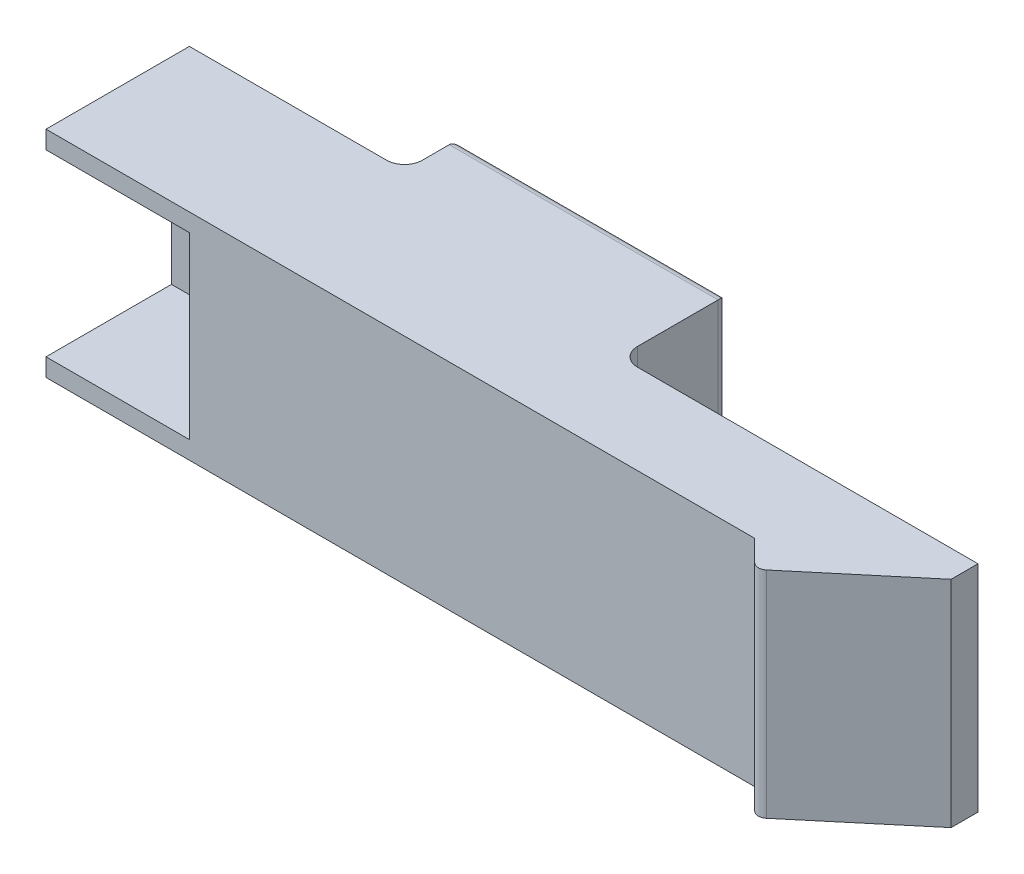
ISO-10303-21;
HEADER;
FILE_DESCRIPTION(('STEP AP214'),'2;1');
FILE_NAME('part.step','',(''),(''),'','','');
FILE_SCHEMA(('AUTOMOTIVE_DESIGN { 1 0 10303 214 1 1 1 1 }'));
ENDSEC;
DATA;
#1=APPLICATION_CONTEXT('core data for automotive mechanical design processes');
#2=APPLICATION_PROTOCOL_DEFINITION('international standard','automotive_design',2000,#1);
#3=PRODUCT_CONTEXT('',#1,'mechanical');
#4=PRODUCT('Part','Part','',(#3));
#5=PRODUCT_RELATED_PRODUCT_CATEGORY('part','',(#4));
#6=PRODUCT_DEFINITION_FORMATION('','',#4);
#7=PRODUCT_DEFINITION_CONTEXT('part definition',#1,'design');
#8=PRODUCT_DEFINITION('design','',#6,#7);
#9=PRODUCT_DEFINITION_SHAPE('','',#8);
#10=(LENGTH_UNIT() NAMED_UNIT(*) SI_UNIT(.MILLI.,.METRE.));
#11=(NAMED_UNIT(*) PLANE_ANGLE_UNIT() SI_UNIT($,.RADIAN.));
#12=(NAMED_UNIT(*) SI_UNIT($,.STERADIAN.) SOLID_ANGLE_UNIT());
#13=UNCERTAINTY_MEASURE_WITH_UNIT(LENGTH_MEASURE(1.E-05),#10,'distance_accuracy_value','');
#14=(GEOMETRIC_REPRESENTATION_CONTEXT(3) GLOBAL_UNCERTAINTY_ASSIGNED_CONTEXT((#13)) GLOBAL_UNIT_ASSIGNED_CONTEXT((#10,
#11,#12)) REPRESENTATION_CONTEXT('',''));
#15=CARTESIAN_POINT('',(0.,0.,0.));
#16=DIRECTION('',(0.,0.,1.));
#17=DIRECTION('',(1.,0.,0.));
#18=AXIS2_PLACEMENT_3D('',#15,#16,#17);
#19=CARTESIAN_POINT('',(0.,0.,0.));
#20=DIRECTION('',(0.,0.,-1.));
#21=DIRECTION('',(-1.,0.,0.));
#22=AXIS2_PLACEMENT_3D('',#19,#20,#21);
#23=PLANE('',#22);
#24=DIRECTION('',(-1.,0.,0.));
#25=VECTOR('',#24,1.);
#26=CARTESIAN_POINT('',(0.,4.5,0.));
#27=LINE('',#26,#25);
#28=CARTESIAN_POINT('',(6.00000000000001,4.5,0.));
#29=VERTEX_POINT('',#28);
#30=CARTESIAN_POINT('',(-5.99999999999999,4.5,0.));
#31=VERTEX_POINT('',#30);
#32=EDGE_CURVE('E333',#29,#31,#27,.T.);
#33=ORIENTED_EDGE('',*,*,#32,.T.);
#34=DIRECTION('',(0.,-1.,0.));
#35=VECTOR('',#34,1.);
#36=CARTESIAN_POINT('',(-5.99999999999999,0.,0.));
#37=LINE('',#36,#35);
#38=CARTESIAN_POINT('',(-5.99999999999999,-4.5,0.));
#39=VERTEX_POINT('',#38);
#40=EDGE_CURVE('E339',#31,#39,#37,.T.);
#41=ORIENTED_EDGE('',*,*,#40,.T.);
#42=DIRECTION('',(1.,0.,0.));
#43=VECTOR('',#42,1.);
#44=CARTESIAN_POINT('',(0.,-4.5,0.));
#45=LINE('',#44,#43);
#46=CARTESIAN_POINT('',(6.00000000000001,-4.5,0.));
#47=VERTEX_POINT('',#46);
#48=EDGE_CURVE('E337',#39,#47,#45,.T.);
#49=ORIENTED_EDGE('',*,*,#48,.T.);
#50=DIRECTION('',(0.,1.,0.));
#51=VECTOR('',#50,1.);
#52=CARTESIAN_POINT('',(6.00000000000001,0.,0.));
#53=LINE('',#52,#51);
#54=EDGE_CURVE('E335',#47,#29,#53,.T.);
#55=ORIENTED_EDGE('',*,*,#54,.T.);
#56=EDGE_LOOP('',(#33,#41,#49,#55));
#57=FACE_BOUND('',#56,.T.);
#58=DIRECTION('',(1.,0.,0.));
#59=VECTOR('',#58,1.);
#60=CARTESIAN_POINT('',(-7.49999999999999,-5.5,0.));
#61=LINE('',#60,#59);
#62=CARTESIAN_POINT('',(7.,-5.5,0.));
#63=VERTEX_POINT('',#62);
#64=CARTESIAN_POINT('',(-6.99999999999999,-5.5,0.));
#65=VERTEX_POINT('',#64);
#66=EDGE_CURVE('E328',#63,#65,#61,.F.);
#67=ORIENTED_EDGE('',*,*,#66,.T.);
#68=DIRECTION('',(0.,-1.,0.));
#69=VECTOR('',#68,1.);
#70=CARTESIAN_POINT('',(-6.99999999999999,6.,0.));
#71=LINE('',#70,#69);
#72=CARTESIAN_POINT('',(-6.99999999999999,5.5,0.));
#73=VERTEX_POINT('',#72);
#74=EDGE_CURVE('E330',#65,#73,#71,.F.);
#75=ORIENTED_EDGE('',*,*,#74,.T.);
#76=DIRECTION('',(-1.,0.,0.));
#77=VECTOR('',#76,1.);
#78=CARTESIAN_POINT('',(7.50000000000001,5.5,0.));
#79=LINE('',#78,#77);
#80=CARTESIAN_POINT('',(7.,5.5,0.));
#81=VERTEX_POINT('',#80);
#82=EDGE_CURVE('E324',#73,#81,#79,.F.);
#83=ORIENTED_EDGE('',*,*,#82,.T.);
#84=DIRECTION('',(0.,1.,0.));
#85=VECTOR('',#84,1.);
#86=CARTESIAN_POINT('',(7.,-6.,0.));
#87=LINE('',#86,#85);
#88=EDGE_CURVE('E326',#81,#63,#87,.F.);
#89=ORIENTED_EDGE('',*,*,#88,.T.);
#90=EDGE_LOOP('',(#67,#75,#83,#89));
#91=FACE_BOUND('',#90,.T.);
#92=ADVANCED_FACE('F35',(#57,#91),#23,.T.);
#93=CARTESIAN_POINT('',(7.50000000000001,-6.,11.));
#94=DIRECTION('',(-1.,0.,0.));
#95=DIRECTION('',(0.,0.,1.));
#96=AXIS2_PLACEMENT_3D('',#93,#94,#95);
#97=PLANE('',#96);
#98=DIRECTION('',(0.,0.,-1.));
#99=VECTOR('',#98,1.);
#100=CARTESIAN_POINT('',(7.50000000000001,6.,11.));
#101=LINE('',#100,#99);
#102=CARTESIAN_POINT('',(7.50000000000001,6.,5.));
#103=VERTEX_POINT('',#102);
#104=CARTESIAN_POINT('',(7.50000000000001,6.,0.5));
#105=VERTEX_POINT('',#104);
#106=EDGE_CURVE('E322',#103,#105,#101,.T.);
#107=ORIENTED_EDGE('',*,*,#106,.F.);
#108=DIRECTION('',(0.,-1.,0.));
#109=VECTOR('',#108,1.);
#110=CARTESIAN_POINT('',(7.50000000000001,-6.,5.));
#111=LINE('',#110,#109);
#112=CARTESIAN_POINT('',(7.50000000000001,-6.,5.));
#113=VERTEX_POINT('',#112);
#114=EDGE_CURVE('E363',#103,#113,#111,.T.);
#115=ORIENTED_EDGE('',*,*,#114,.T.);
#116=DIRECTION('',(0.,0.,-1.));
#117=VECTOR('',#116,1.);
#118=CARTESIAN_POINT('',(7.50000000000001,-6.,11.));
#119=LINE('',#118,#117);
#120=CARTESIAN_POINT('',(7.50000000000001,-6.,0.5));
#121=VERTEX_POINT('',#120);
#122=EDGE_CURVE('E316',#113,#121,#119,.T.);
#123=ORIENTED_EDGE('',*,*,#122,.T.);
#124=DIRECTION('',(0.,1.,0.));
#125=VECTOR('',#124,1.);
#126=CARTESIAN_POINT('',(7.50000000000001,6.,0.5));
#127=LINE('',#126,#125);
#128=EDGE_CURVE('E355',#121,#105,#127,.T.);
#129=ORIENTED_EDGE('',*,*,#128,.T.);
#130=EDGE_LOOP('',(#107,#115,#123,#129));
#131=FACE_BOUND('',#130,.T.);
#132=ADVANCED_FACE('F445',(#131),#97,.F.);
#133=CARTESIAN_POINT('',(-7.49999999999999,6.,11.));
#134=DIRECTION('',(0.,-1.,0.));
#135=DIRECTION('',(0.,0.,-1.));
#136=AXIS2_PLACEMENT_3D('',#133,#134,#135);
#137=PLANE('',#136);
#138=DIRECTION('',(0.707106781186546,0.,0.707106781186549));
#139=VECTOR('',#138,1.);
#140=CARTESIAN_POINT('',(20.041232037029,6.,11.));
#141=LINE('',#140,#139);
#142=CARTESIAN_POINT('',(20.041232037029,6.,11.));
#143=VERTEX_POINT('',#142);
#144=CARTESIAN_POINT('',(21.2172600435488,6.,12.1760280065198));
#145=VERTEX_POINT('',#144);
#146=EDGE_CURVE('E202',#143,#145,#141,.T.);
#147=ORIENTED_EDGE('',*,*,#146,.T.);
#148=CARTESIAN_POINT('',(21.5708134341421,6.,11.8224746159265));
#149=DIRECTION('',(0.,-1.,0.));
#150=DIRECTION('',(0.,0.,-1.));
#151=AXIS2_PLACEMENT_3D('',#148,#149,#150);
#152=CIRCLE('',#151,0.5);
#153=CARTESIAN_POINT('',(21.8922072389853,6.,12.205496837486));
#154=VERTEX_POINT('',#153);
#155=EDGE_CURVE('E57',#145,#154,#152,.F.);
#156=ORIENTED_EDGE('',*,*,#155,.T.);
#157=DIRECTION('',(0.766044443118977,0.,-0.64278760968654));
#158=VECTOR('',#157,1.);
#159=CARTESIAN_POINT('',(21.541232037029,6.,12.5));
#160=LINE('',#159,#158);
#161=CARTESIAN_POINT('',(27.5,6.,7.5));
#162=VERTEX_POINT('',#161);
#163=EDGE_CURVE('E226',#154,#162,#160,.T.);
#164=ORIENTED_EDGE('',*,*,#163,.T.);
#165=DIRECTION('',(0.,0.,-1.));
#166=VECTOR('',#165,1.);
#167=CARTESIAN_POINT('',(27.5,6.,7.5));
#168=LINE('',#167,#166);
#169=CARTESIAN_POINT('',(27.5,6.,6.));
#170=VERTEX_POINT('',#169);
#171=EDGE_CURVE('E228',#162,#170,#168,.T.);
#172=ORIENTED_EDGE('',*,*,#171,.T.);
#173=DIRECTION('',(1.,0.,0.));
#174=VECTOR('',#173,1.);
#175=CARTESIAN_POINT('',(7.50000000000001,6.,6.));
#176=LINE('',#175,#174);
#177=CARTESIAN_POINT('',(8.5,6.,6.));
#178=VERTEX_POINT('',#177);
#179=EDGE_CURVE('E247',#178,#170,#176,.T.);
#180=ORIENTED_EDGE('',*,*,#179,.F.);
#181=CARTESIAN_POINT('',(8.5,6.,5.));
#182=DIRECTION('',(0.,-1.,0.));
#183=DIRECTION('',(0.,0.,-1.));
#184=AXIS2_PLACEMENT_3D('',#181,#182,#183);
#185=CIRCLE('',#184,1.);
#186=EDGE_CURVE('E389',#178,#103,#185,.T.);
#187=ORIENTED_EDGE('',*,*,#186,.T.);
#188=ORIENTED_EDGE('',*,*,#106,.T.);
#189=DIRECTION('',(-1.,0.,0.));
#190=VECTOR('',#189,1.);
#191=CARTESIAN_POINT('',(-7.49999999999999,6.,0.5));
#192=LINE('',#191,#190);
#193=CARTESIAN_POINT('',(-7.49999999999999,6.,0.5));
#194=VERTEX_POINT('',#193);
#195=EDGE_CURVE('E360',#105,#194,#192,.T.);
#196=ORIENTED_EDGE('',*,*,#195,.T.);
#197=DIRECTION('',(0.,0.,-1.));
#198=VECTOR('',#197,1.);
#199=CARTESIAN_POINT('',(-7.49999999999999,6.,11.));
#200=LINE('',#199,#198);
#201=CARTESIAN_POINT('',(-7.49999999999999,6.,2.));
#202=VERTEX_POINT('',#201);
#203=EDGE_CURVE('E320',#202,#194,#200,.T.);
#204=ORIENTED_EDGE('',*,*,#203,.F.);
#205=CARTESIAN_POINT('',(-8.49999999999999,6.,2.));
#206=DIRECTION('',(0.,-1.,0.));
#207=DIRECTION('',(0.,0.,-1.));
#208=AXIS2_PLACEMENT_3D('',#205,#206,#207);
#209=CIRCLE('',#208,1.);
#210=CARTESIAN_POINT('',(-8.49999999999999,6.,3.));
#211=VERTEX_POINT('',#210);
#212=EDGE_CURVE('E396',#202,#211,#209,.T.);
#213=ORIENTED_EDGE('',*,*,#212,.T.);
#214=DIRECTION('',(-1.,0.,0.));
#215=VECTOR('',#214,1.);
#216=CARTESIAN_POINT('',(-19.5,6.,3.));
#217=LINE('',#216,#215);
#218=CARTESIAN_POINT('',(-19.5,6.,3.));
#219=VERTEX_POINT('',#218);
#220=EDGE_CURVE('E281',#211,#219,#217,.T.);
#221=ORIENTED_EDGE('',*,*,#220,.T.);
#222=DIRECTION('',(0.,0.,1.));
#223=VECTOR('',#222,1.);
#224=CARTESIAN_POINT('',(-19.5,6.,3.));
#225=LINE('',#224,#223);
#226=CARTESIAN_POINT('',(-19.5,6.,11.));
#227=VERTEX_POINT('',#226);
#228=EDGE_CURVE('E204',#219,#227,#225,.T.);
#229=ORIENTED_EDGE('',*,*,#228,.T.);
#230=DIRECTION('',(-1.,0.,0.));
#231=VECTOR('',#230,1.);
#232=CARTESIAN_POINT('',(-7.49999999999999,6.,11.));
#233=LINE('',#232,#231);
#234=EDGE_CURVE('E198',#143,#227,#233,.T.);
#235=ORIENTED_EDGE('',*,*,#234,.F.);
#236=EDGE_LOOP('',(#147,#156,#164,#172,#180,#187,#188,#196,#204,#213,#221,#229,#235));
#237=FACE_BOUND('',#236,.T.);
#238=ADVANCED_FACE('F200',(#237),#137,.F.);
#239=CARTESIAN_POINT('',(-7.49999999999999,-6.,11.));
#240=DIRECTION('',(1.,0.,0.));
#241=DIRECTION('',(0.,0.,-1.));
#242=AXIS2_PLACEMENT_3D('',#239,#240,#241);
#243=PLANE('',#242);
#244=DIRECTION('',(0.,0.,-1.));
#245=VECTOR('',#244,1.);
#246=CARTESIAN_POINT('',(-7.49999999999999,-6.,11.));
#247=LINE('',#246,#245);
#248=CARTESIAN_POINT('',(-7.49999999999999,-6.,2.));
#249=VERTEX_POINT('',#248);
#250=CARTESIAN_POINT('',(-7.49999999999999,-6.,0.5));
#251=VERTEX_POINT('',#250);
#252=EDGE_CURVE('E318',#249,#251,#247,.T.);
#253=ORIENTED_EDGE('',*,*,#252,.F.);
#254=DIRECTION('',(0.,1.,0.));
#255=VECTOR('',#254,1.);
#256=CARTESIAN_POINT('',(-7.49999999999999,-6.,2.));
#257=LINE('',#256,#255);
#258=EDGE_CURVE('E391',#249,#202,#257,.T.);
#259=ORIENTED_EDGE('',*,*,#258,.T.);
#260=ORIENTED_EDGE('',*,*,#203,.T.);
#261=DIRECTION('',(0.,-1.,0.));
#262=VECTOR('',#261,1.);
#263=CARTESIAN_POINT('',(-7.49999999999999,-6.,0.5));
#264=LINE('',#263,#262);
#265=EDGE_CURVE('E345',#194,#251,#264,.T.);
#266=ORIENTED_EDGE('',*,*,#265,.T.);
#267=EDGE_LOOP('',(#253,#259,#260,#266));
#268=FACE_BOUND('',#267,.T.);
#269=ADVANCED_FACE('F410',(#268),#243,.F.);
#270=CARTESIAN_POINT('',(-7.49999999999999,-6.,11.));
#271=DIRECTION('',(0.,1.,0.));
#272=DIRECTION('',(0.,0.,1.));
#273=AXIS2_PLACEMENT_3D('',#270,#271,#272);
#274=PLANE('',#273);
#275=DIRECTION('',(0.766044443118977,0.,-0.64278760968654));
#276=VECTOR('',#275,1.);
#277=CARTESIAN_POINT('',(21.541232037029,-6.,12.5));
#278=LINE('',#277,#276);
#279=CARTESIAN_POINT('',(21.8922072389853,-6.,12.205496837486));
#280=VERTEX_POINT('',#279);
#281=CARTESIAN_POINT('',(27.5,-6.,7.5));
#282=VERTEX_POINT('',#281);
#283=EDGE_CURVE('E235',#280,#282,#278,.T.);
#284=ORIENTED_EDGE('',*,*,#283,.F.);
#285=CARTESIAN_POINT('',(21.5708134341421,-6.,11.8224746159265));
#286=DIRECTION('',(0.,1.,0.));
#287=DIRECTION('',(0.,0.,1.));
#288=AXIS2_PLACEMENT_3D('',#285,#286,#287);
#289=CIRCLE('',#288,0.5);
#290=CARTESIAN_POINT('',(21.2172600435488,-6.,12.1760280065198));
#291=VERTEX_POINT('',#290);
#292=EDGE_CURVE('E11',#280,#291,#289,.F.);
#293=ORIENTED_EDGE('',*,*,#292,.T.);
#294=DIRECTION('',(0.707106781186546,0.,0.707106781186549));
#295=VECTOR('',#294,1.);
#296=CARTESIAN_POINT('',(20.041232037029,-6.,11.));
#297=LINE('',#296,#295);
#298=CARTESIAN_POINT('',(20.041232037029,-6.,11.));
#299=VERTEX_POINT('',#298);
#300=EDGE_CURVE('E233',#299,#291,#297,.T.);
#301=ORIENTED_EDGE('',*,*,#300,.F.);
#302=DIRECTION('',(1.,0.,0.));
#303=VECTOR('',#302,1.);
#304=CARTESIAN_POINT('',(-7.49999999999999,-6.,11.));
#305=LINE('',#304,#303);
#306=CARTESIAN_POINT('',(-19.5,-6.,11.));
#307=VERTEX_POINT('',#306);
#308=EDGE_CURVE('E208',#307,#299,#305,.T.);
#309=ORIENTED_EDGE('',*,*,#308,.F.);
#310=DIRECTION('',(0.,0.,1.));
#311=VECTOR('',#310,1.);
#312=CARTESIAN_POINT('',(-19.5,-6.,3.));
#313=LINE('',#312,#311);
#314=CARTESIAN_POINT('',(-19.5,-6.,3.));
#315=VERTEX_POINT('',#314);
#316=EDGE_CURVE('E291',#315,#307,#313,.T.);
#317=ORIENTED_EDGE('',*,*,#316,.F.);
#318=DIRECTION('',(1.,0.,0.));
#319=VECTOR('',#318,1.);
#320=CARTESIAN_POINT('',(-7.49999999999999,-6.,3.));
#321=LINE('',#320,#319);
#322=CARTESIAN_POINT('',(-8.49999999999999,-6.,3.));
#323=VERTEX_POINT('',#322);
#324=EDGE_CURVE('E287',#315,#323,#321,.T.);
#325=ORIENTED_EDGE('',*,*,#324,.T.);
#326=CARTESIAN_POINT('',(-8.49999999999999,-6.,2.));
#327=DIRECTION('',(0.,1.,0.));
#328=DIRECTION('',(0.,0.,1.));
#329=AXIS2_PLACEMENT_3D('',#326,#327,#328);
#330=CIRCLE('',#329,1.);
#331=EDGE_CURVE('E398',#323,#249,#330,.T.);
#332=ORIENTED_EDGE('',*,*,#331,.T.);
#333=ORIENTED_EDGE('',*,*,#252,.T.);
#334=DIRECTION('',(1.,0.,0.));
#335=VECTOR('',#334,1.);
#336=CARTESIAN_POINT('',(7.50000000000001,-6.,0.5));
#337=LINE('',#336,#335);
#338=EDGE_CURVE('E348',#251,#121,#337,.T.);
#339=ORIENTED_EDGE('',*,*,#338,.T.);
#340=ORIENTED_EDGE('',*,*,#122,.F.);
#341=CARTESIAN_POINT('',(8.5,-6.,5.));
#342=DIRECTION('',(0.,1.,0.));
#343=DIRECTION('',(0.,0.,1.));
#344=AXIS2_PLACEMENT_3D('',#341,#342,#343);
#345=CIRCLE('',#344,1.);
#346=CARTESIAN_POINT('',(8.5,-6.,6.));
#347=VERTEX_POINT('',#346);
#348=EDGE_CURVE('E387',#113,#347,#345,.T.);
#349=ORIENTED_EDGE('',*,*,#348,.T.);
#350=DIRECTION('',(-1.,0.,0.));
#351=VECTOR('',#350,1.);
#352=CARTESIAN_POINT('',(12.5,-6.,6.));
#353=LINE('',#352,#351);
#354=CARTESIAN_POINT('',(27.5,-6.,6.));
#355=VERTEX_POINT('',#354);
#356=EDGE_CURVE('E242',#355,#347,#353,.T.);
#357=ORIENTED_EDGE('',*,*,#356,.F.);
#358=DIRECTION('',(0.,0.,-1.));
#359=VECTOR('',#358,1.);
#360=CARTESIAN_POINT('',(27.5,-6.,7.5));
#361=LINE('',#360,#359);
#362=EDGE_CURVE('E220',#282,#355,#361,.T.);
#363=ORIENTED_EDGE('',*,*,#362,.F.);
#364=EDGE_LOOP('',(#284,#293,#301,#309,#317,#325,#332,#333,#339,#340,#349,#357,#363));
#365=FACE_BOUND('',#364,.T.);
#366=ADVANCED_FACE('F404',(#365),#274,.F.);
#367=CARTESIAN_POINT('',(0.,0.,11.));
#368=DIRECTION('',(0.,0.,-1.));
#369=DIRECTION('',(-1.,0.,0.));
#370=AXIS2_PLACEMENT_3D('',#367,#368,#369);
#371=PLANE('',#370);
#372=DIRECTION('',(0.,1.,0.));
#373=VECTOR('',#372,1.);
#374=CARTESIAN_POINT('',(-11.5,5.,11.));
#375=LINE('',#374,#373);
#376=CARTESIAN_POINT('',(-11.5,-5.,11.));
#377=VERTEX_POINT('',#376);
#378=CARTESIAN_POINT('',(-11.5,5.,11.));
#379=VERTEX_POINT('',#378);
#380=EDGE_CURVE('E253',#377,#379,#375,.T.);
#381=ORIENTED_EDGE('',*,*,#380,.F.);
#382=DIRECTION('',(-1.,0.,0.));
#383=VECTOR('',#382,1.);
#384=CARTESIAN_POINT('',(-11.5,-5.,11.));
#385=LINE('',#384,#383);
#386=CARTESIAN_POINT('',(-19.5,-5.,11.));
#387=VERTEX_POINT('',#386);
#388=EDGE_CURVE('E263',#377,#387,#385,.T.);
#389=ORIENTED_EDGE('',*,*,#388,.T.);
#390=DIRECTION('',(0.,-1.,0.));
#391=VECTOR('',#390,1.);
#392=CARTESIAN_POINT('',(-19.5,-6.,11.));
#393=LINE('',#392,#391);
#394=EDGE_CURVE('E274',#387,#307,#393,.T.);
#395=ORIENTED_EDGE('',*,*,#394,.T.);
#396=ORIENTED_EDGE('',*,*,#308,.T.);
#397=DIRECTION('',(0.,1.,0.));
#398=VECTOR('',#397,1.);
#399=CARTESIAN_POINT('',(20.041232037029,-6.,11.));
#400=LINE('',#399,#398);
#401=EDGE_CURVE('E212',#299,#143,#400,.T.);
#402=ORIENTED_EDGE('',*,*,#401,.T.);
#403=ORIENTED_EDGE('',*,*,#234,.T.);
#404=CARTESIAN_POINT('',(-19.5,5.,11.));
#405=VERTEX_POINT('',#404);
#406=EDGE_CURVE('E284',#227,#405,#393,.T.);
#407=ORIENTED_EDGE('',*,*,#406,.T.);
#408=DIRECTION('',(-1.,0.,0.));
#409=VECTOR('',#408,1.);
#410=CARTESIAN_POINT('',(-11.5,5.,11.));
#411=LINE('',#410,#409);
#412=EDGE_CURVE('E277',#379,#405,#411,.T.);
#413=ORIENTED_EDGE('',*,*,#412,.F.);
#414=EDGE_LOOP('',(#381,#389,#395,#396,#402,#403,#407,#413));
#415=FACE_BOUND('',#414,.T.);
#416=ADVANCED_FACE('F214',(#415),#371,.F.);
#417=CARTESIAN_POINT('',(5.50000000000001,-6.,11.));
#418=DIRECTION('',(-1.,0.,0.));
#419=DIRECTION('',(0.,0.,1.));
#420=AXIS2_PLACEMENT_3D('',#417,#418,#419);
#421=PLANE('',#420);
#422=DIRECTION('',(0.,0.,-1.));
#423=VECTOR('',#422,1.);
#424=CARTESIAN_POINT('',(5.50000000000001,4.,11.));
#425=LINE('',#424,#423);
#426=CARTESIAN_POINT('',(5.50000000000001,4.,9.));
#427=VERTEX_POINT('',#426);
#428=CARTESIAN_POINT('',(5.50000000000001,4.,0.5));
#429=VERTEX_POINT('',#428);
#430=EDGE_CURVE('E209',#427,#429,#425,.T.);
#431=ORIENTED_EDGE('',*,*,#430,.T.);
#432=DIRECTION('',(0.,1.,0.));
#433=VECTOR('',#432,1.);
#434=CARTESIAN_POINT('',(5.50000000000001,-6.,0.5));
#435=LINE('',#434,#433);
#436=CARTESIAN_POINT('',(5.50000000000001,-4.,0.5));
#437=VERTEX_POINT('',#436);
#438=EDGE_CURVE('E353',#429,#437,#435,.F.);
#439=ORIENTED_EDGE('',*,*,#438,.T.);
#440=DIRECTION('',(0.,0.,-1.));
#441=VECTOR('',#440,1.);
#442=CARTESIAN_POINT('',(5.50000000000001,-4.,11.));
#443=LINE('',#442,#441);
#444=CARTESIAN_POINT('',(5.50000000000001,-4.,9.));
#445=VERTEX_POINT('',#444);
#446=EDGE_CURVE('E302',#445,#437,#443,.T.);
#447=ORIENTED_EDGE('',*,*,#446,.F.);
#448=DIRECTION('',(0.,1.,0.));
#449=VECTOR('',#448,1.);
#450=CARTESIAN_POINT('',(5.50000000000001,0.,9.));
#451=LINE('',#450,#449);
#452=EDGE_CURVE('E294',#445,#427,#451,.T.);
#453=ORIENTED_EDGE('',*,*,#452,.T.);
#454=EDGE_LOOP('',(#431,#439,#447,#453));
#455=FACE_BOUND('',#454,.T.);
#456=ADVANCED_FACE('F588',(#455),#421,.T.);
#457=CARTESIAN_POINT('',(-7.49999999999999,4.,11.));
#458=DIRECTION('',(0.,-1.,0.));
#459=DIRECTION('',(0.,0.,-1.));
#460=AXIS2_PLACEMENT_3D('',#457,#458,#459);
#461=PLANE('',#460);
#462=DIRECTION('',(0.,0.,-1.));
#463=VECTOR('',#462,1.);
#464=CARTESIAN_POINT('',(-5.49999999999999,4.,11.));
#465=LINE('',#464,#463);
#466=CARTESIAN_POINT('',(-5.49999999999999,4.,9.));
#467=VERTEX_POINT('',#466);
#468=CARTESIAN_POINT('',(-5.49999999999999,4.,0.5));
#469=VERTEX_POINT('',#468);
#470=EDGE_CURVE('E298',#467,#469,#465,.T.);
#471=ORIENTED_EDGE('',*,*,#470,.T.);
#472=DIRECTION('',(-1.,0.,0.));
#473=VECTOR('',#472,1.);
#474=CARTESIAN_POINT('',(-7.49999999999999,4.,0.5));
#475=LINE('',#474,#473);
#476=EDGE_CURVE('E358',#469,#429,#475,.F.);
#477=ORIENTED_EDGE('',*,*,#476,.T.);
#478=ORIENTED_EDGE('',*,*,#430,.F.);
#479=DIRECTION('',(-1.,0.,0.));
#480=VECTOR('',#479,1.);
#481=CARTESIAN_POINT('',(0.,4.,9.));
#482=LINE('',#481,#480);
#483=EDGE_CURVE('E301',#427,#467,#482,.T.);
#484=ORIENTED_EDGE('',*,*,#483,.T.);
#485=EDGE_LOOP('',(#471,#477,#478,#484));
#486=FACE_BOUND('',#485,.T.);
#487=ADVANCED_FACE('F748',(#486),#461,.T.);
#488=CARTESIAN_POINT('',(-5.49999999999999,-6.,11.));
#489=DIRECTION('',(1.,0.,0.));
#490=DIRECTION('',(0.,0.,-1.));
#491=AXIS2_PLACEMENT_3D('',#488,#489,#490);
#492=PLANE('',#491);
#493=DIRECTION('',(0.,0.,-1.));
#494=VECTOR('',#493,1.);
#495=CARTESIAN_POINT('',(-5.49999999999999,-4.,11.));
#496=LINE('',#495,#494);
#497=CARTESIAN_POINT('',(-5.49999999999999,-4.,9.));
#498=VERTEX_POINT('',#497);
#499=CARTESIAN_POINT('',(-5.49999999999999,-4.,0.5));
#500=VERTEX_POINT('',#499);
#501=EDGE_CURVE('E305',#498,#500,#496,.T.);
#502=ORIENTED_EDGE('',*,*,#501,.T.);
#503=DIRECTION('',(0.,-1.,0.));
#504=VECTOR('',#503,1.);
#505=CARTESIAN_POINT('',(-5.49999999999999,-6.,0.5));
#506=LINE('',#505,#504);
#507=EDGE_CURVE('E342',#500,#469,#506,.F.);
#508=ORIENTED_EDGE('',*,*,#507,.T.);
#509=ORIENTED_EDGE('',*,*,#470,.F.);
#510=DIRECTION('',(0.,-1.,0.));
#511=VECTOR('',#510,1.);
#512=CARTESIAN_POINT('',(-5.49999999999999,0.,9.));
#513=LINE('',#512,#511);
#514=EDGE_CURVE('E310',#467,#498,#513,.T.);
#515=ORIENTED_EDGE('',*,*,#514,.T.);
#516=EDGE_LOOP('',(#502,#508,#509,#515));
#517=FACE_BOUND('',#516,.T.);
#518=ADVANCED_FACE('F741',(#517),#492,.T.);
#519=CARTESIAN_POINT('',(-7.49999999999999,-4.,11.));
#520=DIRECTION('',(0.,1.,0.));
#521=DIRECTION('',(0.,0.,1.));
#522=AXIS2_PLACEMENT_3D('',#519,#520,#521);
#523=PLANE('',#522);
#524=ORIENTED_EDGE('',*,*,#446,.T.);
#525=DIRECTION('',(1.,0.,0.));
#526=VECTOR('',#525,1.);
#527=CARTESIAN_POINT('',(-7.49999999999999,-4.,0.5));
#528=LINE('',#527,#526);
#529=EDGE_CURVE('E351',#437,#500,#528,.F.);
#530=ORIENTED_EDGE('',*,*,#529,.T.);
#531=ORIENTED_EDGE('',*,*,#501,.F.);
#532=DIRECTION('',(1.,0.,0.));
#533=VECTOR('',#532,1.);
#534=CARTESIAN_POINT('',(0.,-4.,9.));
#535=LINE('',#534,#533);
#536=EDGE_CURVE('E306',#498,#445,#535,.T.);
#537=ORIENTED_EDGE('',*,*,#536,.T.);
#538=EDGE_LOOP('',(#524,#530,#531,#537));
#539=FACE_BOUND('',#538,.T.);
#540=ADVANCED_FACE('F732',(#539),#523,.T.);
#541=CARTESIAN_POINT('',(0.,0.,9.));
#542=DIRECTION('',(0.,0.,-1.));
#543=DIRECTION('',(-1.,0.,0.));
#544=AXIS2_PLACEMENT_3D('',#541,#542,#543);
#545=PLANE('',#544);
#546=ORIENTED_EDGE('',*,*,#452,.F.);
#547=ORIENTED_EDGE('',*,*,#536,.F.);
#548=ORIENTED_EDGE('',*,*,#514,.F.);
#549=ORIENTED_EDGE('',*,*,#483,.F.);
#550=EDGE_LOOP('',(#546,#547,#548,#549));
#551=FACE_BOUND('',#550,.T.);
#552=ADVANCED_FACE('F695',(#551),#545,.T.);
#553=CARTESIAN_POINT('',(-19.5,-6.,3.));
#554=DIRECTION('',(-1.,0.,0.));
#555=DIRECTION('',(0.,-1.,0.));
#556=AXIS2_PLACEMENT_3D('',#553,#554,#555);
#557=PLANE('',#556);
#558=DIRECTION('',(0.,0.,1.));
#559=VECTOR('',#558,1.);
#560=CARTESIAN_POINT('',(-19.5,-5.,11.));
#561=LINE('',#560,#559);
#562=CARTESIAN_POINT('',(-19.5,-5.,4.));
#563=VERTEX_POINT('',#562);
#564=EDGE_CURVE('E264',#563,#387,#561,.T.);
#565=ORIENTED_EDGE('',*,*,#564,.F.);
#566=DIRECTION('',(0.,-1.,0.));
#567=VECTOR('',#566,1.);
#568=CARTESIAN_POINT('',(-19.5,-5.,4.));
#569=LINE('',#568,#567);
#570=CARTESIAN_POINT('',(-19.5,5.,4.));
#571=VERTEX_POINT('',#570);
#572=EDGE_CURVE('E254',#571,#563,#569,.T.);
#573=ORIENTED_EDGE('',*,*,#572,.F.);
#574=DIRECTION('',(0.,0.,-1.));
#575=VECTOR('',#574,1.);
#576=CARTESIAN_POINT('',(-19.5,5.,4.));
#577=LINE('',#576,#575);
#578=EDGE_CURVE('E266',#405,#571,#577,.T.);
#579=ORIENTED_EDGE('',*,*,#578,.F.);
#580=ORIENTED_EDGE('',*,*,#406,.F.);
#581=ORIENTED_EDGE('',*,*,#228,.F.);
#582=DIRECTION('',(0.,-1.,0.));
#583=VECTOR('',#582,1.);
#584=CARTESIAN_POINT('',(-19.5,-6.,3.));
#585=LINE('',#584,#583);
#586=EDGE_CURVE('E283',#219,#315,#585,.T.);
#587=ORIENTED_EDGE('',*,*,#586,.T.);
#588=ORIENTED_EDGE('',*,*,#316,.T.);
#589=ORIENTED_EDGE('',*,*,#394,.F.);
#590=EDGE_LOOP('',(#565,#573,#579,#580,#581,#587,#588,#589));
#591=FACE_BOUND('',#590,.T.);
#592=ADVANCED_FACE('F420',(#591),#557,.T.);
#593=CARTESIAN_POINT('',(0.,0.,3.));
#594=DIRECTION('',(0.,0.,-1.));
#595=DIRECTION('',(-1.,0.,0.));
#596=AXIS2_PLACEMENT_3D('',#593,#594,#595);
#597=PLANE('',#596);
#598=ORIENTED_EDGE('',*,*,#220,.F.);
#599=DIRECTION('',(0.,1.,0.));
#600=VECTOR('',#599,1.);
#601=CARTESIAN_POINT('',(-8.49999999999999,0.,3.));
#602=LINE('',#601,#600);
#603=EDGE_CURVE('E394',#211,#323,#602,.F.);
#604=ORIENTED_EDGE('',*,*,#603,.T.);
#605=ORIENTED_EDGE('',*,*,#324,.F.);
#606=ORIENTED_EDGE('',*,*,#586,.F.);
#607=EDGE_LOOP('',(#598,#604,#605,#606));
#608=FACE_BOUND('',#607,.T.);
#609=ADVANCED_FACE('F417',(#608),#597,.T.);
#610=CARTESIAN_POINT('',(-11.5,-5.,11.));
#611=DIRECTION('',(0.,-1.,0.));
#612=DIRECTION('',(0.,0.,-1.));
#613=AXIS2_PLACEMENT_3D('',#610,#611,#612);
#614=PLANE('',#613);
#615=ORIENTED_EDGE('',*,*,#564,.T.);
#616=ORIENTED_EDGE('',*,*,#388,.F.);
#617=DIRECTION('',(0.,0.,1.));
#618=VECTOR('',#617,1.);
#619=CARTESIAN_POINT('',(-11.5,-5.,11.));
#620=LINE('',#619,#618);
#621=CARTESIAN_POINT('',(-11.5,-5.,4.));
#622=VERTEX_POINT('',#621);
#623=EDGE_CURVE('E250',#622,#377,#620,.T.);
#624=ORIENTED_EDGE('',*,*,#623,.F.);
#625=DIRECTION('',(-1.,0.,0.));
#626=VECTOR('',#625,1.);
#627=CARTESIAN_POINT('',(-11.5,-5.,4.));
#628=LINE('',#627,#626);
#629=EDGE_CURVE('E272',#622,#563,#628,.T.);
#630=ORIENTED_EDGE('',*,*,#629,.T.);
#631=EDGE_LOOP('',(#615,#616,#624,#630));
#632=FACE_BOUND('',#631,.T.);
#633=ADVANCED_FACE('F432',(#632),#614,.F.);
#634=CARTESIAN_POINT('',(-11.5,-5.,4.));
#635=DIRECTION('',(0.,0.,-1.));
#636=DIRECTION('',(-1.,0.,0.));
#637=AXIS2_PLACEMENT_3D('',#634,#635,#636);
#638=PLANE('',#637);
#639=ORIENTED_EDGE('',*,*,#572,.T.);
#640=ORIENTED_EDGE('',*,*,#629,.F.);
#641=DIRECTION('',(0.,-1.,0.));
#642=VECTOR('',#641,1.);
#643=CARTESIAN_POINT('',(-11.5,-5.,4.));
#644=LINE('',#643,#642);
#645=CARTESIAN_POINT('',(-11.5,5.,4.));
#646=VERTEX_POINT('',#645);
#647=EDGE_CURVE('E260',#646,#622,#644,.T.);
#648=ORIENTED_EDGE('',*,*,#647,.F.);
#649=DIRECTION('',(-1.,0.,0.));
#650=VECTOR('',#649,1.);
#651=CARTESIAN_POINT('',(-11.5,5.,4.));
#652=LINE('',#651,#650);
#653=EDGE_CURVE('E275',#646,#571,#652,.T.);
#654=ORIENTED_EDGE('',*,*,#653,.T.);
#655=EDGE_LOOP('',(#639,#640,#648,#654));
#656=FACE_BOUND('',#655,.T.);
#657=ADVANCED_FACE('F434',(#656),#638,.F.);
#658=CARTESIAN_POINT('',(-11.5,5.,4.));
#659=DIRECTION('',(0.,1.,0.));
#660=DIRECTION('',(0.,0.,1.));
#661=AXIS2_PLACEMENT_3D('',#658,#659,#660);
#662=PLANE('',#661);
#663=ORIENTED_EDGE('',*,*,#578,.T.);
#664=ORIENTED_EDGE('',*,*,#653,.F.);
#665=DIRECTION('',(0.,0.,-1.));
#666=VECTOR('',#665,1.);
#667=CARTESIAN_POINT('',(-11.5,5.,4.));
#668=LINE('',#667,#666);
#669=EDGE_CURVE('E257',#379,#646,#668,.T.);
#670=ORIENTED_EDGE('',*,*,#669,.F.);
#671=ORIENTED_EDGE('',*,*,#412,.T.);
#672=EDGE_LOOP('',(#663,#664,#670,#671));
#673=FACE_BOUND('',#672,.T.);
#674=ADVANCED_FACE('F426',(#673),#662,.F.);
#675=CARTESIAN_POINT('',(-11.5,0.,0.));
#676=DIRECTION('',(1.,0.,0.));
#677=DIRECTION('',(0.,0.,-1.));
#678=AXIS2_PLACEMENT_3D('',#675,#676,#677);
#679=PLANE('',#678);
#680=ORIENTED_EDGE('',*,*,#623,.T.);
#681=ORIENTED_EDGE('',*,*,#380,.T.);
#682=ORIENTED_EDGE('',*,*,#669,.T.);
#683=ORIENTED_EDGE('',*,*,#647,.T.);
#684=EDGE_LOOP('',(#680,#681,#682,#683));
#685=FACE_BOUND('',#684,.T.);
#686=ADVANCED_FACE('F429',(#685),#679,.F.);
#687=CARTESIAN_POINT('',(6.00000000000001,0.,0.5));
#688=DIRECTION('',(0.,1.,0.));
#689=DIRECTION('',(0.,0.,1.));
#690=AXIS2_PLACEMENT_3D('',#687,#688,#689);
#691=CYLINDRICAL_SURFACE('',#690,0.5);
#692=CARTESIAN_POINT('',(6.00000000000001,-4.5,0.5));
#693=DIRECTION('',(0.707106781186547,0.707106781186547,0.));
#694=DIRECTION('',(0.707106781186547,-0.707106781186547,0.));
#695=AXIS2_PLACEMENT_3D('',#692,#693,#694);
#696=ELLIPSE('',#695,0.707106781186547,0.5);
#697=EDGE_CURVE('E369',#437,#47,#696,.F.);
#698=ORIENTED_EDGE('',*,*,#697,.F.);
#699=ORIENTED_EDGE('',*,*,#438,.F.);
#700=CARTESIAN_POINT('',(6.00000000000001,4.5,0.5));
#701=DIRECTION('',(-0.707106781186547,0.707106781186547,0.));
#702=DIRECTION('',(0.707106781186547,0.707106781186547,0.));
#703=AXIS2_PLACEMENT_3D('',#700,#701,#702);
#704=ELLIPSE('',#703,0.707106781186547,0.5);
#705=EDGE_CURVE('E267',#29,#429,#704,.T.);
#706=ORIENTED_EDGE('',*,*,#705,.F.);
#707=ORIENTED_EDGE('',*,*,#54,.F.);
#708=EDGE_LOOP('',(#698,#699,#706,#707));
#709=FACE_BOUND('',#708,.T.);
#710=ADVANCED_FACE('F475',(#709),#691,.T.);
#711=CARTESIAN_POINT('',(0.,4.5,0.5));
#712=DIRECTION('',(-1.,0.,0.));
#713=DIRECTION('',(0.,0.,1.));
#714=AXIS2_PLACEMENT_3D('',#711,#712,#713);
#715=CYLINDRICAL_SURFACE('',#714,0.5);
#716=ORIENTED_EDGE('',*,*,#705,.T.);
#717=ORIENTED_EDGE('',*,*,#476,.F.);
#718=CARTESIAN_POINT('',(-5.99999999999999,4.5,0.5));
#719=DIRECTION('',(-0.707106781186547,-0.707106781186547,0.));
#720=DIRECTION('',(0.707106781186547,-0.707106781186547,0.));
#721=AXIS2_PLACEMENT_3D('',#718,#719,#720);
#722=ELLIPSE('',#721,0.707106781186547,0.5);
#723=EDGE_CURVE('E366',#31,#469,#722,.T.);
#724=ORIENTED_EDGE('',*,*,#723,.F.);
#725=ORIENTED_EDGE('',*,*,#32,.F.);
#726=EDGE_LOOP('',(#716,#717,#724,#725));
#727=FACE_BOUND('',#726,.T.);
#728=ADVANCED_FACE('F471',(#727),#715,.T.);
#729=CARTESIAN_POINT('',(0.,-4.5,0.5));
#730=DIRECTION('',(1.,0.,0.));
#731=DIRECTION('',(0.,0.,-1.));
#732=AXIS2_PLACEMENT_3D('',#729,#730,#731);
#733=CYLINDRICAL_SURFACE('',#732,0.5);
#734=ORIENTED_EDGE('',*,*,#697,.T.);
#735=ORIENTED_EDGE('',*,*,#48,.F.);
#736=CARTESIAN_POINT('',(-5.99999999999999,-4.5,0.5));
#737=DIRECTION('',(0.707106781186547,-0.707106781186547,0.));
#738=DIRECTION('',(-0.707106781186547,-0.707106781186547,0.));
#739=AXIS2_PLACEMENT_3D('',#736,#737,#738);
#740=ELLIPSE('',#739,0.707106781186547,0.5);
#741=EDGE_CURVE('E364',#500,#39,#740,.F.);
#742=ORIENTED_EDGE('',*,*,#741,.F.);
#743=ORIENTED_EDGE('',*,*,#529,.F.);
#744=EDGE_LOOP('',(#734,#735,#742,#743));
#745=FACE_BOUND('',#744,.T.);
#746=ADVANCED_FACE('F467',(#745),#733,.T.);
#747=CARTESIAN_POINT('',(-5.99999999999999,0.,0.5));
#748=DIRECTION('',(0.,-1.,0.));
#749=DIRECTION('',(0.,0.,-1.));
#750=AXIS2_PLACEMENT_3D('',#747,#748,#749);
#751=CYLINDRICAL_SURFACE('',#750,0.5);
#752=ORIENTED_EDGE('',*,*,#723,.T.);
#753=ORIENTED_EDGE('',*,*,#507,.F.);
#754=ORIENTED_EDGE('',*,*,#741,.T.);
#755=ORIENTED_EDGE('',*,*,#40,.F.);
#756=EDGE_LOOP('',(#752,#753,#754,#755));
#757=FACE_BOUND('',#756,.T.);
#758=ADVANCED_FACE('F463',(#757),#751,.T.);
#759=CARTESIAN_POINT('',(7.,-6.,0.5));
#760=DIRECTION('',(0.,-1.,0.));
#761=DIRECTION('',(0.,0.,-1.));
#762=AXIS2_PLACEMENT_3D('',#759,#760,#761);
#763=CYLINDRICAL_SURFACE('',#762,0.5);
#764=CARTESIAN_POINT('',(7.,-5.5,0.5));
#765=DIRECTION('',(-0.707106781186547,-0.707106781186547,0.));
#766=DIRECTION('',(0.707106781186547,-0.707106781186547,0.));
#767=AXIS2_PLACEMENT_3D('',#764,#765,#766);
#768=ELLIPSE('',#767,0.707106781186547,0.5);
#769=EDGE_CURVE('E378',#63,#121,#768,.T.);
#770=ORIENTED_EDGE('',*,*,#769,.F.);
#771=ORIENTED_EDGE('',*,*,#88,.F.);
#772=CARTESIAN_POINT('',(7.,5.5,0.5));
#773=DIRECTION('',(0.707106781186547,-0.707106781186547,0.));
#774=DIRECTION('',(0.707106781186547,0.707106781186547,0.));
#775=AXIS2_PLACEMENT_3D('',#772,#773,#774);
#776=ELLIPSE('',#775,0.707106781186547,0.5);
#777=EDGE_CURVE('E367',#105,#81,#776,.F.);
#778=ORIENTED_EDGE('',*,*,#777,.F.);
#779=ORIENTED_EDGE('',*,*,#128,.F.);
#780=EDGE_LOOP('',(#770,#771,#778,#779));
#781=FACE_BOUND('',#780,.T.);
#782=ADVANCED_FACE('F466',(#781),#763,.T.);
#783=CARTESIAN_POINT('',(-7.49999999999999,5.5,0.5));
#784=DIRECTION('',(1.,0.,0.));
#785=DIRECTION('',(0.,0.,-1.));
#786=AXIS2_PLACEMENT_3D('',#783,#784,#785);
#787=CYLINDRICAL_SURFACE('',#786,0.5);
#788=ORIENTED_EDGE('',*,*,#777,.T.);
#789=ORIENTED_EDGE('',*,*,#82,.F.);
#790=CARTESIAN_POINT('',(-6.99999999999999,5.5,0.5));
#791=DIRECTION('',(0.707106781186547,0.707106781186547,0.));
#792=DIRECTION('',(0.707106781186547,-0.707106781186547,0.));
#793=AXIS2_PLACEMENT_3D('',#790,#791,#792);
#794=ELLIPSE('',#793,0.707106781186547,0.5);
#795=EDGE_CURVE('E376',#194,#73,#794,.F.);
#796=ORIENTED_EDGE('',*,*,#795,.F.);
#797=ORIENTED_EDGE('',*,*,#195,.F.);
#798=EDGE_LOOP('',(#788,#789,#796,#797));
#799=FACE_BOUND('',#798,.T.);
#800=ADVANCED_FACE('F488',(#799),#787,.T.);
#801=CARTESIAN_POINT('',(-7.49999999999999,-5.5,0.5));
#802=DIRECTION('',(-1.,0.,0.));
#803=DIRECTION('',(0.,0.,1.));
#804=AXIS2_PLACEMENT_3D('',#801,#802,#803);
#805=CYLINDRICAL_SURFACE('',#804,0.5);
#806=ORIENTED_EDGE('',*,*,#769,.T.);
#807=ORIENTED_EDGE('',*,*,#338,.F.);
#808=CARTESIAN_POINT('',(-6.99999999999999,-5.5,0.5));
#809=DIRECTION('',(-0.707106781186547,0.707106781186547,0.));
#810=DIRECTION('',(-0.707106781186547,-0.707106781186547,0.));
#811=AXIS2_PLACEMENT_3D('',#808,#809,#810);
#812=ELLIPSE('',#811,0.707106781186547,0.5);
#813=EDGE_CURVE('E249',#65,#251,#812,.T.);
#814=ORIENTED_EDGE('',*,*,#813,.F.);
#815=ORIENTED_EDGE('',*,*,#66,.F.);
#816=EDGE_LOOP('',(#806,#807,#814,#815));
#817=FACE_BOUND('',#816,.T.);
#818=ADVANCED_FACE('F484',(#817),#805,.T.);
#819=CARTESIAN_POINT('',(-6.99999999999999,-6.,0.5));
#820=DIRECTION('',(0.,1.,0.));
#821=DIRECTION('',(0.,0.,1.));
#822=AXIS2_PLACEMENT_3D('',#819,#820,#821);
#823=CYLINDRICAL_SURFACE('',#822,0.5);
#824=ORIENTED_EDGE('',*,*,#795,.T.);
#825=ORIENTED_EDGE('',*,*,#74,.F.);
#826=ORIENTED_EDGE('',*,*,#813,.T.);
#827=ORIENTED_EDGE('',*,*,#265,.F.);
#828=EDGE_LOOP('',(#824,#825,#826,#827));
#829=FACE_BOUND('',#828,.T.);
#830=ADVANCED_FACE('F480',(#829),#823,.T.);
#831=CARTESIAN_POINT('',(0.,0.,6.));
#832=DIRECTION('',(0.,0.,-1.));
#833=DIRECTION('',(-1.,0.,0.));
#834=AXIS2_PLACEMENT_3D('',#831,#832,#833);
#835=PLANE('',#834);
#836=ORIENTED_EDGE('',*,*,#356,.T.);
#837=DIRECTION('',(0.,-1.,0.));
#838=VECTOR('',#837,1.);
#839=CARTESIAN_POINT('',(8.5,0.,6.));
#840=LINE('',#839,#838);
#841=EDGE_CURVE('E385',#347,#178,#840,.F.);
#842=ORIENTED_EDGE('',*,*,#841,.T.);
#843=ORIENTED_EDGE('',*,*,#179,.T.);
#844=DIRECTION('',(0.,1.,0.));
#845=VECTOR('',#844,1.);
#846=CARTESIAN_POINT('',(27.5,-6.,6.));
#847=LINE('',#846,#845);
#848=EDGE_CURVE('E239',#355,#170,#847,.T.);
#849=ORIENTED_EDGE('',*,*,#848,.F.);
#850=EDGE_LOOP('',(#836,#842,#843,#849));
#851=FACE_BOUND('',#850,.T.);
#852=ADVANCED_FACE('F483',(#851),#835,.T.);
#853=CARTESIAN_POINT('',(27.5,-6.,7.5));
#854=DIRECTION('',(1.,0.,0.));
#855=DIRECTION('',(0.,0.,-1.));
#856=AXIS2_PLACEMENT_3D('',#853,#854,#855);
#857=PLANE('',#856);
#858=ORIENTED_EDGE('',*,*,#848,.T.);
#859=ORIENTED_EDGE('',*,*,#171,.F.);
#860=DIRECTION('',(0.,1.,0.));
#861=VECTOR('',#860,1.);
#862=CARTESIAN_POINT('',(27.5,-6.,7.5));
#863=LINE('',#862,#861);
#864=EDGE_CURVE('E219',#282,#162,#863,.T.);
#865=ORIENTED_EDGE('',*,*,#864,.F.);
#866=ORIENTED_EDGE('',*,*,#362,.T.);
#867=EDGE_LOOP('',(#858,#859,#865,#866));
#868=FACE_BOUND('',#867,.T.);
#869=ADVANCED_FACE('F512',(#868),#857,.T.);
#870=CARTESIAN_POINT('',(21.541232037029,-6.,12.5));
#871=DIRECTION('',(0.64278760968654,0.,0.766044443118977));
#872=DIRECTION('',(0.766044443118977,0.,-0.64278760968654));
#873=AXIS2_PLACEMENT_3D('',#870,#871,#872);
#874=PLANE('',#873);
#875=ORIENTED_EDGE('',*,*,#163,.F.);
#876=DIRECTION('',(0.,1.,0.));
#877=VECTOR('',#876,1.);
#878=CARTESIAN_POINT('',(21.8922072389853,-6.,12.205496837486));
#879=LINE('',#878,#877);
#880=EDGE_CURVE('E43',#154,#280,#879,.F.);
#881=ORIENTED_EDGE('',*,*,#880,.T.);
#882=ORIENTED_EDGE('',*,*,#283,.T.);
#883=ORIENTED_EDGE('',*,*,#864,.T.);
#884=EDGE_LOOP('',(#875,#881,#882,#883));
#885=FACE_BOUND('',#884,.T.);
#886=ADVANCED_FACE('F509',(#885),#874,.T.);
#887=CARTESIAN_POINT('',(20.041232037029,-6.,11.));
#888=DIRECTION('',(-0.707106781186549,0.,0.707106781186546));
#889=DIRECTION('',(0.707106781186546,0.,0.707106781186549));
#890=AXIS2_PLACEMENT_3D('',#887,#888,#889);
#891=PLANE('',#890);
#892=ORIENTED_EDGE('',*,*,#300,.T.);
#893=DIRECTION('',(0.,1.,0.));
#894=VECTOR('',#893,1.);
#895=CARTESIAN_POINT('',(21.2172600435488,-6.,12.1760280065198));
#896=LINE('',#895,#894);
#897=EDGE_CURVE('E225',#291,#145,#896,.T.);
#898=ORIENTED_EDGE('',*,*,#897,.T.);
#899=ORIENTED_EDGE('',*,*,#146,.F.);
#900=ORIENTED_EDGE('',*,*,#401,.F.);
#901=EDGE_LOOP('',(#892,#898,#899,#900));
#902=FACE_BOUND('',#901,.T.);
#903=ADVANCED_FACE('F223',(#902),#891,.T.);
#904=CARTESIAN_POINT('',(8.5,-6.,5.));
#905=DIRECTION('',(0.,-1.,0.));
#906=DIRECTION('',(0.,0.,-1.));
#907=AXIS2_PLACEMENT_3D('',#904,#905,#906);
#908=CYLINDRICAL_SURFACE('',#907,1.);
#909=ORIENTED_EDGE('',*,*,#186,.F.);
#910=ORIENTED_EDGE('',*,*,#841,.F.);
#911=ORIENTED_EDGE('',*,*,#348,.F.);
#912=ORIENTED_EDGE('',*,*,#114,.F.);
#913=EDGE_LOOP('',(#909,#910,#911,#912));
#914=FACE_BOUND('',#913,.T.);
#915=ADVANCED_FACE('F496',(#914),#908,.F.);
#916=CARTESIAN_POINT('',(-8.49999999999999,-6.,2.));
#917=DIRECTION('',(0.,1.,0.));
#918=DIRECTION('',(0.,0.,1.));
#919=AXIS2_PLACEMENT_3D('',#916,#917,#918);
#920=CYLINDRICAL_SURFACE('',#919,1.);
#921=ORIENTED_EDGE('',*,*,#331,.F.);
#922=ORIENTED_EDGE('',*,*,#603,.F.);
#923=ORIENTED_EDGE('',*,*,#212,.F.);
#924=ORIENTED_EDGE('',*,*,#258,.F.);
#925=EDGE_LOOP('',(#921,#922,#923,#924));
#926=FACE_BOUND('',#925,.T.);
#927=ADVANCED_FACE('F413',(#926),#920,.F.);
#928=CARTESIAN_POINT('',(21.5708134341421,-6.,11.8224746159265));
#929=DIRECTION('',(0.,1.,0.));
#930=DIRECTION('',(0.,0.,1.));
#931=AXIS2_PLACEMENT_3D('',#928,#929,#930);
#932=CYLINDRICAL_SURFACE('',#931,0.5);
#933=ORIENTED_EDGE('',*,*,#292,.F.);
#934=ORIENTED_EDGE('',*,*,#880,.F.);
#935=ORIENTED_EDGE('',*,*,#155,.F.);
#936=ORIENTED_EDGE('',*,*,#897,.F.);
#937=EDGE_LOOP('',(#933,#934,#935,#936));
#938=FACE_BOUND('',#937,.T.);
#939=ADVANCED_FACE('F37',(#938),#932,.T.);
#940=CLOSED_SHELL('',(#92,#132,#238,#269,#366,#416,#456,#487,#518,#540,#552,#592,#609,#633,#657,
#674,#686,#710,#728,#746,#758,#782,#800,#818,#830,#852,#869,#886,#903,#915,#927,#939));
#941=MANIFOLD_SOLID_BREP('B2',#940);
#942=ADVANCED_BREP_SHAPE_REPRESENTATION('',(#18,#941),#14);
#943=SHAPE_DEFINITION_REPRESENTATION(#9,#942);
ENDSEC;
END-ISO-10303-21;
